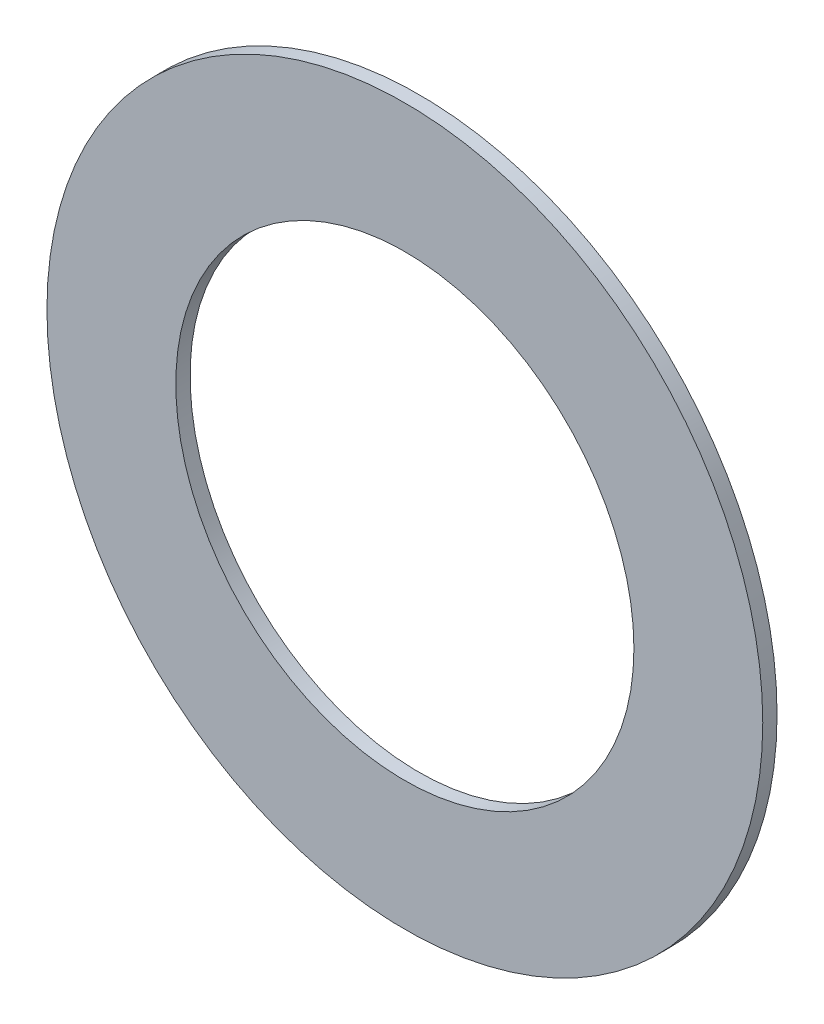
ISO-10303-21;
HEADER;
FILE_DESCRIPTION(('STEP AP214'),'2;1');
FILE_NAME('part.step','',(''),(''),'','','');
FILE_SCHEMA(('AUTOMOTIVE_DESIGN { 1 0 10303 214 1 1 1 1 }'));
ENDSEC;
DATA;
#1=APPLICATION_CONTEXT('core data for automotive mechanical design processes');
#2=APPLICATION_PROTOCOL_DEFINITION('international standard','automotive_design',2000,#1);
#3=PRODUCT_CONTEXT('',#1,'mechanical');
#4=PRODUCT('Part','Part','',(#3));
#5=PRODUCT_RELATED_PRODUCT_CATEGORY('part','',(#4));
#6=PRODUCT_DEFINITION_FORMATION('','',#4);
#7=PRODUCT_DEFINITION_CONTEXT('part definition',#1,'design');
#8=PRODUCT_DEFINITION('design','',#6,#7);
#9=PRODUCT_DEFINITION_SHAPE('','',#8);
#10=(LENGTH_UNIT() NAMED_UNIT(*) SI_UNIT(.MILLI.,.METRE.));
#11=(NAMED_UNIT(*) PLANE_ANGLE_UNIT() SI_UNIT($,.RADIAN.));
#12=(NAMED_UNIT(*) SI_UNIT($,.STERADIAN.) SOLID_ANGLE_UNIT());
#13=UNCERTAINTY_MEASURE_WITH_UNIT(LENGTH_MEASURE(1.E-05),#10,'distance_accuracy_value','');
#14=(GEOMETRIC_REPRESENTATION_CONTEXT(3) GLOBAL_UNCERTAINTY_ASSIGNED_CONTEXT((#13)) GLOBAL_UNIT_ASSIGNED_CONTEXT((#10,
#11,#12)) REPRESENTATION_CONTEXT('',''));
#15=CARTESIAN_POINT('',(0.,0.,0.));
#16=DIRECTION('',(0.,0.,1.));
#17=DIRECTION('',(1.,0.,0.));
#18=AXIS2_PLACEMENT_3D('',#15,#16,#17);
#19=CARTESIAN_POINT('',(0.,0.,0.79248));
#20=DIRECTION('',(0.,0.,1.));
#21=DIRECTION('',(1.,0.,0.));
#22=AXIS2_PLACEMENT_3D('',#19,#20,#21);
#23=PLANE('',#22);
#24=CARTESIAN_POINT('',(0.,0.,0.79248));
#25=DIRECTION('',(0.,0.,1.));
#26=DIRECTION('',(1.,0.,0.));
#27=AXIS2_PLACEMENT_3D('',#24,#25,#26);
#28=CIRCLE('',#27,19.84375);
#29=CARTESIAN_POINT('',(19.84375,0.,0.79248));
#30=VERTEX_POINT('',#29);
#31=EDGE_CURVE('E10',#30,#30,#28,.T.);
#32=ORIENTED_EDGE('',*,*,#31,.T.);
#33=EDGE_LOOP('',(#32));
#34=FACE_BOUND('',#33,.T.);
#35=CARTESIAN_POINT('',(0.,0.,0.79248));
#36=DIRECTION('',(0.,0.,1.));
#37=DIRECTION('',(1.,0.,0.));
#38=AXIS2_PLACEMENT_3D('',#35,#36,#37);
#39=CIRCLE('',#38,12.7);
#40=CARTESIAN_POINT('',(12.7,0.,0.79248));
#41=VERTEX_POINT('',#40);
#42=EDGE_CURVE('E48',#41,#41,#39,.T.);
#43=ORIENTED_EDGE('',*,*,#42,.F.);
#44=EDGE_LOOP('',(#43));
#45=FACE_BOUND('',#44,.T.);
#46=ADVANCED_FACE('F37',(#34,#45),#23,.T.);
#47=CARTESIAN_POINT('',(0.,0.,0.));
#48=DIRECTION('',(0.,0.,1.));
#49=DIRECTION('',(1.,0.,0.));
#50=AXIS2_PLACEMENT_3D('',#47,#48,#49);
#51=PLANE('',#50);
#52=CARTESIAN_POINT('',(0.,0.,0.));
#53=DIRECTION('',(0.,0.,1.));
#54=DIRECTION('',(1.,0.,0.));
#55=AXIS2_PLACEMENT_3D('',#52,#53,#54);
#56=CIRCLE('',#55,19.84375);
#57=CARTESIAN_POINT('',(19.84375,0.,0.));
#58=VERTEX_POINT('',#57);
#59=EDGE_CURVE('E41',#58,#58,#56,.T.);
#60=ORIENTED_EDGE('',*,*,#59,.F.);
#61=EDGE_LOOP('',(#60));
#62=FACE_BOUND('',#61,.T.);
#63=CARTESIAN_POINT('',(0.,0.,0.));
#64=DIRECTION('',(0.,0.,1.));
#65=DIRECTION('',(1.,0.,0.));
#66=AXIS2_PLACEMENT_3D('',#63,#64,#65);
#67=CIRCLE('',#66,12.7);
#68=CARTESIAN_POINT('',(12.7,0.,0.));
#69=VERTEX_POINT('',#68);
#70=EDGE_CURVE('E50',#69,#69,#67,.T.);
#71=ORIENTED_EDGE('',*,*,#70,.T.);
#72=EDGE_LOOP('',(#71));
#73=FACE_BOUND('',#72,.T.);
#74=ADVANCED_FACE('F60',(#62,#73),#51,.F.);
#75=CARTESIAN_POINT('',(0.,0.,0.79248));
#76=DIRECTION('',(0.,0.,-1.));
#77=DIRECTION('',(-1.,0.,0.));
#78=AXIS2_PLACEMENT_3D('',#75,#76,#77);
#79=CYLINDRICAL_SURFACE('',#78,19.84375);
#80=ORIENTED_EDGE('',*,*,#31,.F.);
#81=EDGE_LOOP('',(#80));
#82=FACE_BOUND('',#81,.T.);
#83=ORIENTED_EDGE('',*,*,#59,.T.);
#84=EDGE_LOOP('',(#83));
#85=FACE_BOUND('',#84,.T.);
#86=ADVANCED_FACE('F39',(#82,#85),#79,.T.);
#87=CARTESIAN_POINT('',(0.,0.,0.79248));
#88=DIRECTION('',(0.,0.,-1.));
#89=DIRECTION('',(-1.,0.,0.));
#90=AXIS2_PLACEMENT_3D('',#87,#88,#89);
#91=CYLINDRICAL_SURFACE('',#90,12.7);
#92=ORIENTED_EDGE('',*,*,#42,.T.);
#93=EDGE_LOOP('',(#92));
#94=FACE_BOUND('',#93,.T.);
#95=ORIENTED_EDGE('',*,*,#70,.F.);
#96=EDGE_LOOP('',(#95));
#97=FACE_BOUND('',#96,.T.);
#98=ADVANCED_FACE('F56',(#94,#97),#91,.F.);
#99=CLOSED_SHELL('',(#46,#74,#86,#98));
#100=MANIFOLD_SOLID_BREP('B2',#99);
#101=ADVANCED_BREP_SHAPE_REPRESENTATION('',(#18,#100),#14);
#102=SHAPE_DEFINITION_REPRESENTATION(#9,#101);
ENDSEC;
END-ISO-10303-21;
